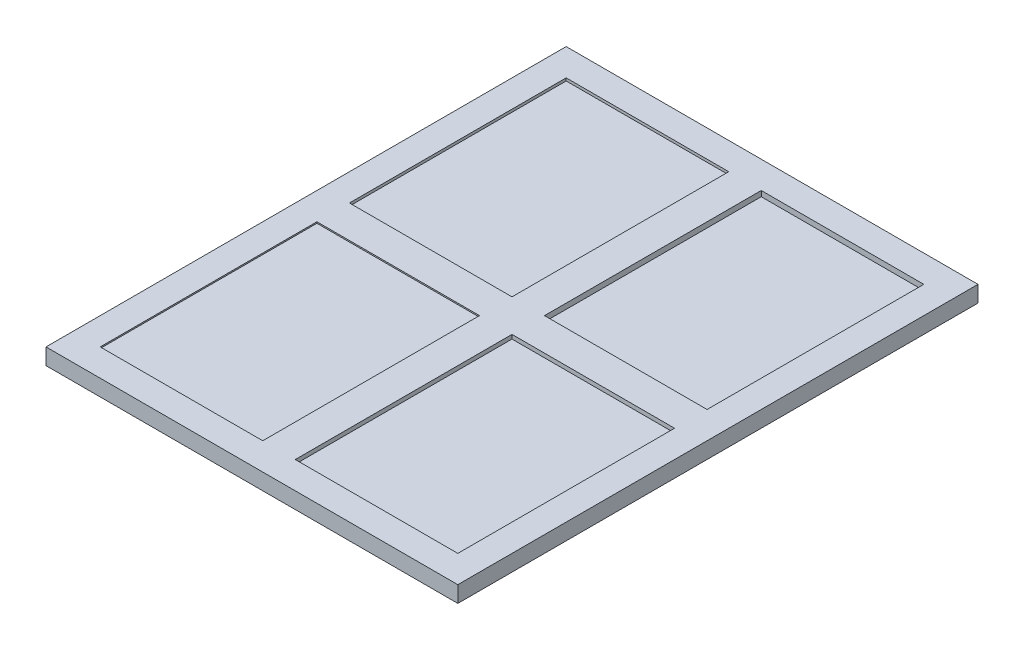
ISO-10303-21;
HEADER;
FILE_DESCRIPTION(('STEP AP214'),'2;1');
FILE_NAME('part.step','',(''),(''),'','','');
FILE_SCHEMA(('AUTOMOTIVE_DESIGN { 1 0 10303 214 1 1 1 1 }'));
ENDSEC;
DATA;
#1=APPLICATION_CONTEXT('core data for automotive mechanical design processes');
#2=APPLICATION_PROTOCOL_DEFINITION('international standard','automotive_design',2000,#1);
#3=PRODUCT_CONTEXT('',#1,'mechanical');
#4=PRODUCT('Part','Part','',(#3));
#5=PRODUCT_RELATED_PRODUCT_CATEGORY('part','',(#4));
#6=PRODUCT_DEFINITION_FORMATION('','',#4);
#7=PRODUCT_DEFINITION_CONTEXT('part definition',#1,'design');
#8=PRODUCT_DEFINITION('design','',#6,#7);
#9=PRODUCT_DEFINITION_SHAPE('','',#8);
#10=(LENGTH_UNIT() NAMED_UNIT(*) SI_UNIT(.MILLI.,.METRE.));
#11=(NAMED_UNIT(*) PLANE_ANGLE_UNIT() SI_UNIT($,.RADIAN.));
#12=(NAMED_UNIT(*) SI_UNIT($,.STERADIAN.) SOLID_ANGLE_UNIT());
#13=UNCERTAINTY_MEASURE_WITH_UNIT(LENGTH_MEASURE(1.E-05),#10,'distance_accuracy_value','');
#14=(GEOMETRIC_REPRESENTATION_CONTEXT(3) GLOBAL_UNCERTAINTY_ASSIGNED_CONTEXT((#13)) GLOBAL_UNIT_ASSIGNED_CONTEXT((#10,
#11,#12)) REPRESENTATION_CONTEXT('',''));
#15=CARTESIAN_POINT('',(0.,0.,0.));
#16=DIRECTION('',(0.,0.,1.));
#17=DIRECTION('',(1.,0.,0.));
#18=AXIS2_PLACEMENT_3D('',#15,#16,#17);
#19=CARTESIAN_POINT('',(0.,0.25,0.));
#20=DIRECTION('',(0.,1.,0.));
#21=DIRECTION('',(0.,0.,1.));
#22=AXIS2_PLACEMENT_3D('',#19,#20,#21);
#23=PLANE('',#22);
#24=DIRECTION('',(1.,0.,0.));
#25=VECTOR('',#24,1.);
#26=CARTESIAN_POINT('',(3.,0.25,43.));
#27=LINE('',#26,#25);
#28=CARTESIAN_POINT('',(3.,0.25,43.));
#29=VERTEX_POINT('',#28);
#30=CARTESIAN_POINT('',(33.,0.25,43.));
#31=VERTEX_POINT('',#30);
#32=EDGE_CURVE('E248',#29,#31,#27,.T.);
#33=ORIENTED_EDGE('',*,*,#32,.F.);
#34=DIRECTION('',(0.,0.,1.));
#35=VECTOR('',#34,1.);
#36=CARTESIAN_POINT('',(3.,0.25,3.));
#37=LINE('',#36,#35);
#38=CARTESIAN_POINT('',(3.,0.25,3.));
#39=VERTEX_POINT('',#38);
#40=EDGE_CURVE('E250',#39,#29,#37,.T.);
#41=ORIENTED_EDGE('',*,*,#40,.F.);
#42=DIRECTION('',(-1.,0.,0.));
#43=VECTOR('',#42,1.);
#44=CARTESIAN_POINT('',(3.,0.25,3.));
#45=LINE('',#44,#43);
#46=CARTESIAN_POINT('',(33.,0.25,3.));
#47=VERTEX_POINT('',#46);
#48=EDGE_CURVE('E243',#47,#39,#45,.T.);
#49=ORIENTED_EDGE('',*,*,#48,.F.);
#50=DIRECTION('',(0.,0.,-1.));
#51=VECTOR('',#50,1.);
#52=CARTESIAN_POINT('',(33.,0.25,3.));
#53=LINE('',#52,#51);
#54=EDGE_CURVE('E245',#31,#47,#53,.T.);
#55=ORIENTED_EDGE('',*,*,#54,.F.);
#56=EDGE_LOOP('',(#33,#41,#49,#55));
#57=FACE_BOUND('',#56,.T.);
#58=DIRECTION('',(1.,0.,0.));
#59=VECTOR('',#58,1.);
#60=CARTESIAN_POINT('',(-33.,0.25,-3.));
#61=LINE('',#60,#59);
#62=CARTESIAN_POINT('',(-33.,0.25,-3.));
#63=VERTEX_POINT('',#62);
#64=CARTESIAN_POINT('',(-3.,0.25,-3.));
#65=VERTEX_POINT('',#64);
#66=EDGE_CURVE('E214',#63,#65,#61,.T.);
#67=ORIENTED_EDGE('',*,*,#66,.F.);
#68=DIRECTION('',(0.,0.,1.));
#69=VECTOR('',#68,1.);
#70=CARTESIAN_POINT('',(-33.,0.25,-43.));
#71=LINE('',#70,#69);
#72=CARTESIAN_POINT('',(-33.,0.25,-43.));
#73=VERTEX_POINT('',#72);
#74=EDGE_CURVE('E216',#73,#63,#71,.T.);
#75=ORIENTED_EDGE('',*,*,#74,.F.);
#76=DIRECTION('',(-1.,0.,0.));
#77=VECTOR('',#76,1.);
#78=CARTESIAN_POINT('',(-33.,0.25,-43.));
#79=LINE('',#78,#77);
#80=CARTESIAN_POINT('',(-3.00000000000001,0.25,-43.));
#81=VERTEX_POINT('',#80);
#82=EDGE_CURVE('E209',#81,#73,#79,.T.);
#83=ORIENTED_EDGE('',*,*,#82,.F.);
#84=DIRECTION('',(0.,0.,-1.));
#85=VECTOR('',#84,1.);
#86=CARTESIAN_POINT('',(-3.00000000000001,0.25,-43.));
#87=LINE('',#86,#85);
#88=EDGE_CURVE('E211',#65,#81,#87,.T.);
#89=ORIENTED_EDGE('',*,*,#88,.F.);
#90=EDGE_LOOP('',(#67,#75,#83,#89));
#91=FACE_BOUND('',#90,.T.);
#92=DIRECTION('',(0.,0.,1.));
#93=VECTOR('',#92,1.);
#94=CARTESIAN_POINT('',(-38.,0.25,-48.));
#95=LINE('',#94,#93);
#96=CARTESIAN_POINT('',(-38.,0.25,-48.));
#97=VERTEX_POINT('',#96);
#98=CARTESIAN_POINT('',(-38.,0.25,48.));
#99=VERTEX_POINT('',#98);
#100=EDGE_CURVE('E198',#97,#99,#95,.T.);
#101=ORIENTED_EDGE('',*,*,#100,.T.);
#102=DIRECTION('',(1.,0.,0.));
#103=VECTOR('',#102,1.);
#104=CARTESIAN_POINT('',(-38.,0.25,48.));
#105=LINE('',#104,#103);
#106=CARTESIAN_POINT('',(38.,0.25,48.));
#107=VERTEX_POINT('',#106);
#108=EDGE_CURVE('E196',#99,#107,#105,.T.);
#109=ORIENTED_EDGE('',*,*,#108,.T.);
#110=DIRECTION('',(0.,0.,-1.));
#111=VECTOR('',#110,1.);
#112=CARTESIAN_POINT('',(38.,0.25,-48.));
#113=LINE('',#112,#111);
#114=CARTESIAN_POINT('',(38.,0.25,-48.));
#115=VERTEX_POINT('',#114);
#116=EDGE_CURVE('E185',#107,#115,#113,.T.);
#117=ORIENTED_EDGE('',*,*,#116,.T.);
#118=DIRECTION('',(-1.,0.,0.));
#119=VECTOR('',#118,1.);
#120=CARTESIAN_POINT('',(-38.,0.25,-48.));
#121=LINE('',#120,#119);
#122=EDGE_CURVE('E193',#115,#97,#121,.T.);
#123=ORIENTED_EDGE('',*,*,#122,.T.);
#124=EDGE_LOOP('',(#101,#109,#117,#123));
#125=FACE_BOUND('',#124,.T.);
#126=DIRECTION('',(1.,0.,0.));
#127=VECTOR('',#126,1.);
#128=CARTESIAN_POINT('',(3.,0.25,-3.));
#129=LINE('',#128,#127);
#130=CARTESIAN_POINT('',(3.,0.25,-3.));
#131=VERTEX_POINT('',#130);
#132=CARTESIAN_POINT('',(33.,0.25,-3.));
#133=VERTEX_POINT('',#132);
#134=EDGE_CURVE('E231',#131,#133,#129,.T.);
#135=ORIENTED_EDGE('',*,*,#134,.F.);
#136=DIRECTION('',(0.,0.,1.));
#137=VECTOR('',#136,1.);
#138=CARTESIAN_POINT('',(3.,0.25,-43.));
#139=LINE('',#138,#137);
#140=CARTESIAN_POINT('',(3.,0.25,-43.));
#141=VERTEX_POINT('',#140);
#142=EDGE_CURVE('E233',#141,#131,#139,.T.);
#143=ORIENTED_EDGE('',*,*,#142,.F.);
#144=DIRECTION('',(-1.,0.,0.));
#145=VECTOR('',#144,1.);
#146=CARTESIAN_POINT('',(3.,0.25,-43.));
#147=LINE('',#146,#145);
#148=CARTESIAN_POINT('',(33.,0.25,-43.));
#149=VERTEX_POINT('',#148);
#150=EDGE_CURVE('E226',#149,#141,#147,.T.);
#151=ORIENTED_EDGE('',*,*,#150,.F.);
#152=DIRECTION('',(0.,0.,-1.));
#153=VECTOR('',#152,1.);
#154=CARTESIAN_POINT('',(33.,0.25,-43.));
#155=LINE('',#154,#153);
#156=EDGE_CURVE('E228',#133,#149,#155,.T.);
#157=ORIENTED_EDGE('',*,*,#156,.F.);
#158=EDGE_LOOP('',(#135,#143,#151,#157));
#159=FACE_BOUND('',#158,.T.);
#160=DIRECTION('',(1.,0.,0.));
#161=VECTOR('',#160,1.);
#162=CARTESIAN_POINT('',(-33.,0.25,43.));
#163=LINE('',#162,#161);
#164=CARTESIAN_POINT('',(-33.,0.25,43.));
#165=VERTEX_POINT('',#164);
#166=CARTESIAN_POINT('',(-2.99999999999999,0.25,43.));
#167=VERTEX_POINT('',#166);
#168=EDGE_CURVE('E278',#165,#167,#163,.T.);
#169=ORIENTED_EDGE('',*,*,#168,.F.);
#170=DIRECTION('',(0.,0.,1.));
#171=VECTOR('',#170,1.);
#172=CARTESIAN_POINT('',(-33.,0.25,3.));
#173=LINE('',#172,#171);
#174=CARTESIAN_POINT('',(-33.,0.25,3.));
#175=VERTEX_POINT('',#174);
#176=EDGE_CURVE('E264',#175,#165,#173,.T.);
#177=ORIENTED_EDGE('',*,*,#176,.F.);
#178=DIRECTION('',(-1.,0.,0.));
#179=VECTOR('',#178,1.);
#180=CARTESIAN_POINT('',(-33.,0.25,3.));
#181=LINE('',#180,#179);
#182=CARTESIAN_POINT('',(-3.,0.25,3.));
#183=VERTEX_POINT('',#182);
#184=EDGE_CURVE('E260',#183,#175,#181,.T.);
#185=ORIENTED_EDGE('',*,*,#184,.F.);
#186=DIRECTION('',(0.,0.,-1.));
#187=VECTOR('',#186,1.);
#188=CARTESIAN_POINT('',(-3.,0.25,3.));
#189=LINE('',#188,#187);
#190=EDGE_CURVE('E276',#167,#183,#189,.T.);
#191=ORIENTED_EDGE('',*,*,#190,.F.);
#192=EDGE_LOOP('',(#169,#177,#185,#191));
#193=FACE_BOUND('',#192,.T.);
#194=ADVANCED_FACE('F33',(#57,#91,#125,#159,#193),#23,.T.);
#195=CARTESIAN_POINT('',(-38.,0.25,-48.));
#196=DIRECTION('',(1.,0.,0.));
#197=DIRECTION('',(0.,0.,-1.));
#198=AXIS2_PLACEMENT_3D('',#195,#196,#197);
#199=PLANE('',#198);
#200=DIRECTION('',(0.,-1.,0.));
#201=VECTOR('',#200,1.);
#202=CARTESIAN_POINT('',(-38.,0.25,-48.));
#203=LINE('',#202,#201);
#204=CARTESIAN_POINT('',(-38.,-2.75,-48.));
#205=VERTEX_POINT('',#204);
#206=EDGE_CURVE('E188',#97,#205,#203,.T.);
#207=ORIENTED_EDGE('',*,*,#206,.T.);
#208=DIRECTION('',(0.,0.,1.));
#209=VECTOR('',#208,1.);
#210=CARTESIAN_POINT('',(-38.,-2.75,-48.));
#211=LINE('',#210,#209);
#212=CARTESIAN_POINT('',(-38.,-2.75,48.));
#213=VERTEX_POINT('',#212);
#214=EDGE_CURVE('E48',#205,#213,#211,.T.);
#215=ORIENTED_EDGE('',*,*,#214,.T.);
#216=DIRECTION('',(0.,-1.,0.));
#217=VECTOR('',#216,1.);
#218=CARTESIAN_POINT('',(-38.,0.25,48.));
#219=LINE('',#218,#217);
#220=EDGE_CURVE('E41',#99,#213,#219,.T.);
#221=ORIENTED_EDGE('',*,*,#220,.F.);
#222=ORIENTED_EDGE('',*,*,#100,.F.);
#223=EDGE_LOOP('',(#207,#215,#221,#222));
#224=FACE_BOUND('',#223,.T.);
#225=ADVANCED_FACE('F35',(#224),#199,.F.);
#226=CARTESIAN_POINT('',(-38.,0.25,48.));
#227=DIRECTION('',(0.,0.,-1.));
#228=DIRECTION('',(-1.,0.,0.));
#229=AXIS2_PLACEMENT_3D('',#226,#227,#228);
#230=PLANE('',#229);
#231=ORIENTED_EDGE('',*,*,#220,.T.);
#232=DIRECTION('',(-1.,0.,0.));
#233=VECTOR('',#232,1.);
#234=CARTESIAN_POINT('',(-41.8589167350482,-2.75,48.));
#235=LINE('',#234,#233);
#236=CARTESIAN_POINT('',(38.,-2.75,48.));
#237=VERTEX_POINT('',#236);
#238=EDGE_CURVE('E170',#237,#213,#235,.T.);
#239=ORIENTED_EDGE('',*,*,#238,.F.);
#240=DIRECTION('',(0.,-1.,0.));
#241=VECTOR('',#240,1.);
#242=CARTESIAN_POINT('',(38.,0.25,48.));
#243=LINE('',#242,#241);
#244=EDGE_CURVE('E180',#107,#237,#243,.T.);
#245=ORIENTED_EDGE('',*,*,#244,.F.);
#246=ORIENTED_EDGE('',*,*,#108,.F.);
#247=EDGE_LOOP('',(#231,#239,#245,#246));
#248=FACE_BOUND('',#247,.T.);
#249=ADVANCED_FACE('F179',(#248),#230,.F.);
#250=CARTESIAN_POINT('',(38.,0.25,-48.));
#251=DIRECTION('',(-1.,0.,0.));
#252=DIRECTION('',(0.,0.,1.));
#253=AXIS2_PLACEMENT_3D('',#250,#251,#252);
#254=PLANE('',#253);
#255=ORIENTED_EDGE('',*,*,#244,.T.);
#256=DIRECTION('',(0.,0.,-1.));
#257=VECTOR('',#256,1.);
#258=CARTESIAN_POINT('',(38.,-2.75,-48.));
#259=LINE('',#258,#257);
#260=CARTESIAN_POINT('',(38.,-2.75,-48.));
#261=VERTEX_POINT('',#260);
#262=EDGE_CURVE('E167',#237,#261,#259,.T.);
#263=ORIENTED_EDGE('',*,*,#262,.T.);
#264=DIRECTION('',(0.,-1.,0.));
#265=VECTOR('',#264,1.);
#266=CARTESIAN_POINT('',(38.,0.25,-48.));
#267=LINE('',#266,#265);
#268=EDGE_CURVE('E186',#115,#261,#267,.T.);
#269=ORIENTED_EDGE('',*,*,#268,.F.);
#270=ORIENTED_EDGE('',*,*,#116,.F.);
#271=EDGE_LOOP('',(#255,#263,#269,#270));
#272=FACE_BOUND('',#271,.T.);
#273=ADVANCED_FACE('F184',(#272),#254,.F.);
#274=CARTESIAN_POINT('',(-38.,0.25,-48.));
#275=DIRECTION('',(0.,0.,1.));
#276=DIRECTION('',(1.,0.,0.));
#277=AXIS2_PLACEMENT_3D('',#274,#275,#276);
#278=PLANE('',#277);
#279=ORIENTED_EDGE('',*,*,#268,.T.);
#280=DIRECTION('',(-1.,0.,0.));
#281=VECTOR('',#280,1.);
#282=CARTESIAN_POINT('',(-38.,-2.75,-48.));
#283=LINE('',#282,#281);
#284=EDGE_CURVE('E11',#261,#205,#283,.T.);
#285=ORIENTED_EDGE('',*,*,#284,.T.);
#286=ORIENTED_EDGE('',*,*,#206,.F.);
#287=ORIENTED_EDGE('',*,*,#122,.F.);
#288=EDGE_LOOP('',(#279,#285,#286,#287));
#289=FACE_BOUND('',#288,.T.);
#290=ADVANCED_FACE('F321',(#289),#278,.F.);
#291=CARTESIAN_POINT('',(-33.,0.25,-43.));
#292=DIRECTION('',(1.,0.,0.));
#293=DIRECTION('',(0.,0.,-1.));
#294=AXIS2_PLACEMENT_3D('',#291,#292,#293);
#295=PLANE('',#294);
#296=DIRECTION('',(0.,-1.,0.));
#297=VECTOR('',#296,1.);
#298=CARTESIAN_POINT('',(-33.,0.25,-3.));
#299=LINE('',#298,#297);
#300=CARTESIAN_POINT('',(-33.,-0.25,-3.));
#301=VERTEX_POINT('',#300);
#302=EDGE_CURVE('E201',#63,#301,#299,.T.);
#303=ORIENTED_EDGE('',*,*,#302,.T.);
#304=DIRECTION('',(0.,0.,1.));
#305=VECTOR('',#304,1.);
#306=CARTESIAN_POINT('',(-33.,-0.25,-3.));
#307=LINE('',#306,#305);
#308=CARTESIAN_POINT('',(-33.,-0.25,-43.));
#309=VERTEX_POINT('',#308);
#310=EDGE_CURVE('E289',#309,#301,#307,.T.);
#311=ORIENTED_EDGE('',*,*,#310,.F.);
#312=DIRECTION('',(0.,-1.,0.));
#313=VECTOR('',#312,1.);
#314=CARTESIAN_POINT('',(-33.,0.25,-43.));
#315=LINE('',#314,#313);
#316=EDGE_CURVE('E207',#73,#309,#315,.T.);
#317=ORIENTED_EDGE('',*,*,#316,.F.);
#318=ORIENTED_EDGE('',*,*,#74,.T.);
#319=EDGE_LOOP('',(#303,#311,#317,#318));
#320=FACE_BOUND('',#319,.T.);
#321=ADVANCED_FACE('F407',(#320),#295,.T.);
#322=CARTESIAN_POINT('',(-33.,0.25,-3.));
#323=DIRECTION('',(0.,0.,-1.));
#324=DIRECTION('',(-1.,0.,0.));
#325=AXIS2_PLACEMENT_3D('',#322,#323,#324);
#326=PLANE('',#325);
#327=DIRECTION('',(0.,-1.,0.));
#328=VECTOR('',#327,1.);
#329=CARTESIAN_POINT('',(-3.,0.25,-3.));
#330=LINE('',#329,#328);
#331=CARTESIAN_POINT('',(-3.,-0.25,-3.));
#332=VERTEX_POINT('',#331);
#333=EDGE_CURVE('E203',#65,#332,#330,.T.);
#334=ORIENTED_EDGE('',*,*,#333,.T.);
#335=DIRECTION('',(1.,0.,0.));
#336=VECTOR('',#335,1.);
#337=CARTESIAN_POINT('',(-3.,-0.25,-3.));
#338=LINE('',#337,#336);
#339=EDGE_CURVE('E286',#301,#332,#338,.T.);
#340=ORIENTED_EDGE('',*,*,#339,.F.);
#341=ORIENTED_EDGE('',*,*,#302,.F.);
#342=ORIENTED_EDGE('',*,*,#66,.T.);
#343=EDGE_LOOP('',(#334,#340,#341,#342));
#344=FACE_BOUND('',#343,.T.);
#345=ADVANCED_FACE('F403',(#344),#326,.T.);
#346=CARTESIAN_POINT('',(-3.00000000000001,0.25,-43.));
#347=DIRECTION('',(-1.,0.,0.));
#348=DIRECTION('',(0.,0.,1.));
#349=AXIS2_PLACEMENT_3D('',#346,#347,#348);
#350=PLANE('',#349);
#351=DIRECTION('',(0.,-1.,0.));
#352=VECTOR('',#351,1.);
#353=CARTESIAN_POINT('',(-3.00000000000001,0.25,-43.));
#354=LINE('',#353,#352);
#355=CARTESIAN_POINT('',(-3.00000000000001,-0.25,-43.));
#356=VERTEX_POINT('',#355);
#357=EDGE_CURVE('E205',#81,#356,#354,.T.);
#358=ORIENTED_EDGE('',*,*,#357,.T.);
#359=DIRECTION('',(0.,0.,-1.));
#360=VECTOR('',#359,1.);
#361=CARTESIAN_POINT('',(-3.00000000000001,-0.25,-43.));
#362=LINE('',#361,#360);
#363=EDGE_CURVE('E283',#332,#356,#362,.T.);
#364=ORIENTED_EDGE('',*,*,#363,.F.);
#365=ORIENTED_EDGE('',*,*,#333,.F.);
#366=ORIENTED_EDGE('',*,*,#88,.T.);
#367=EDGE_LOOP('',(#358,#364,#365,#366));
#368=FACE_BOUND('',#367,.T.);
#369=ADVANCED_FACE('F399',(#368),#350,.T.);
#370=CARTESIAN_POINT('',(-33.,0.25,-43.));
#371=DIRECTION('',(0.,0.,1.));
#372=DIRECTION('',(1.,0.,0.));
#373=AXIS2_PLACEMENT_3D('',#370,#371,#372);
#374=PLANE('',#373);
#375=ORIENTED_EDGE('',*,*,#316,.T.);
#376=DIRECTION('',(-1.,0.,0.));
#377=VECTOR('',#376,1.);
#378=CARTESIAN_POINT('',(-33.,-0.25,-43.));
#379=LINE('',#378,#377);
#380=EDGE_CURVE('E274',#356,#309,#379,.T.);
#381=ORIENTED_EDGE('',*,*,#380,.F.);
#382=ORIENTED_EDGE('',*,*,#357,.F.);
#383=ORIENTED_EDGE('',*,*,#82,.T.);
#384=EDGE_LOOP('',(#375,#381,#382,#383));
#385=FACE_BOUND('',#384,.T.);
#386=ADVANCED_FACE('F395',(#385),#374,.T.);
#387=CARTESIAN_POINT('',(3.,0.25,-43.));
#388=DIRECTION('',(1.,0.,0.));
#389=DIRECTION('',(0.,0.,-1.));
#390=AXIS2_PLACEMENT_3D('',#387,#388,#389);
#391=PLANE('',#390);
#392=DIRECTION('',(0.,-1.,0.));
#393=VECTOR('',#392,1.);
#394=CARTESIAN_POINT('',(3.,0.25,-3.));
#395=LINE('',#394,#393);
#396=CARTESIAN_POINT('',(3.,-0.75,-3.));
#397=VERTEX_POINT('',#396);
#398=EDGE_CURVE('E218',#131,#397,#395,.T.);
#399=ORIENTED_EDGE('',*,*,#398,.T.);
#400=DIRECTION('',(0.,0.,1.));
#401=VECTOR('',#400,1.);
#402=CARTESIAN_POINT('',(3.,-0.75,-43.));
#403=LINE('',#402,#401);
#404=CARTESIAN_POINT('',(3.,-0.75,-43.));
#405=VERTEX_POINT('',#404);
#406=EDGE_CURVE('E313',#405,#397,#403,.T.);
#407=ORIENTED_EDGE('',*,*,#406,.F.);
#408=DIRECTION('',(0.,-1.,0.));
#409=VECTOR('',#408,1.);
#410=CARTESIAN_POINT('',(3.,0.25,-43.));
#411=LINE('',#410,#409);
#412=EDGE_CURVE('E224',#141,#405,#411,.T.);
#413=ORIENTED_EDGE('',*,*,#412,.F.);
#414=ORIENTED_EDGE('',*,*,#142,.T.);
#415=EDGE_LOOP('',(#399,#407,#413,#414));
#416=FACE_BOUND('',#415,.T.);
#417=ADVANCED_FACE('F391',(#416),#391,.T.);
#418=CARTESIAN_POINT('',(3.,0.25,-3.));
#419=DIRECTION('',(0.,0.,-1.));
#420=DIRECTION('',(-1.,0.,0.));
#421=AXIS2_PLACEMENT_3D('',#418,#419,#420);
#422=PLANE('',#421);
#423=DIRECTION('',(0.,-1.,0.));
#424=VECTOR('',#423,1.);
#425=CARTESIAN_POINT('',(33.,0.25,-3.));
#426=LINE('',#425,#424);
#427=CARTESIAN_POINT('',(33.,-0.75,-3.));
#428=VERTEX_POINT('',#427);
#429=EDGE_CURVE('E220',#133,#428,#426,.T.);
#430=ORIENTED_EDGE('',*,*,#429,.T.);
#431=DIRECTION('',(1.,0.,0.));
#432=VECTOR('',#431,1.);
#433=CARTESIAN_POINT('',(3.,-0.75,-3.));
#434=LINE('',#433,#432);
#435=EDGE_CURVE('E310',#397,#428,#434,.T.);
#436=ORIENTED_EDGE('',*,*,#435,.F.);
#437=ORIENTED_EDGE('',*,*,#398,.F.);
#438=ORIENTED_EDGE('',*,*,#134,.T.);
#439=EDGE_LOOP('',(#430,#436,#437,#438));
#440=FACE_BOUND('',#439,.T.);
#441=ADVANCED_FACE('F387',(#440),#422,.T.);
#442=CARTESIAN_POINT('',(33.,0.25,-43.));
#443=DIRECTION('',(-1.,0.,0.));
#444=DIRECTION('',(0.,0.,1.));
#445=AXIS2_PLACEMENT_3D('',#442,#443,#444);
#446=PLANE('',#445);
#447=DIRECTION('',(0.,-1.,0.));
#448=VECTOR('',#447,1.);
#449=CARTESIAN_POINT('',(33.,0.25,-43.));
#450=LINE('',#449,#448);
#451=CARTESIAN_POINT('',(33.,-0.75,-43.));
#452=VERTEX_POINT('',#451);
#453=EDGE_CURVE('E222',#149,#452,#450,.T.);
#454=ORIENTED_EDGE('',*,*,#453,.T.);
#455=DIRECTION('',(0.,0.,-1.));
#456=VECTOR('',#455,1.);
#457=CARTESIAN_POINT('',(33.,-0.75,-43.));
#458=LINE('',#457,#456);
#459=EDGE_CURVE('E307',#428,#452,#458,.T.);
#460=ORIENTED_EDGE('',*,*,#459,.F.);
#461=ORIENTED_EDGE('',*,*,#429,.F.);
#462=ORIENTED_EDGE('',*,*,#156,.T.);
#463=EDGE_LOOP('',(#454,#460,#461,#462));
#464=FACE_BOUND('',#463,.T.);
#465=ADVANCED_FACE('F383',(#464),#446,.T.);
#466=CARTESIAN_POINT('',(3.,0.25,-43.));
#467=DIRECTION('',(0.,0.,1.));
#468=DIRECTION('',(1.,0.,0.));
#469=AXIS2_PLACEMENT_3D('',#466,#467,#468);
#470=PLANE('',#469);
#471=ORIENTED_EDGE('',*,*,#412,.T.);
#472=DIRECTION('',(-1.,0.,0.));
#473=VECTOR('',#472,1.);
#474=CARTESIAN_POINT('',(3.,-0.75,-43.));
#475=LINE('',#474,#473);
#476=EDGE_CURVE('E304',#452,#405,#475,.T.);
#477=ORIENTED_EDGE('',*,*,#476,.F.);
#478=ORIENTED_EDGE('',*,*,#453,.F.);
#479=ORIENTED_EDGE('',*,*,#150,.T.);
#480=EDGE_LOOP('',(#471,#477,#478,#479));
#481=FACE_BOUND('',#480,.T.);
#482=ADVANCED_FACE('F379',(#481),#470,.T.);
#483=CARTESIAN_POINT('',(3.,0.25,3.));
#484=DIRECTION('',(1.,0.,0.));
#485=DIRECTION('',(0.,0.,-1.));
#486=AXIS2_PLACEMENT_3D('',#483,#484,#485);
#487=PLANE('',#486);
#488=DIRECTION('',(0.,-1.,0.));
#489=VECTOR('',#488,1.);
#490=CARTESIAN_POINT('',(3.,0.25,43.));
#491=LINE('',#490,#489);
#492=CARTESIAN_POINT('',(3.,-0.5,43.));
#493=VERTEX_POINT('',#492);
#494=EDGE_CURVE('E235',#29,#493,#491,.T.);
#495=ORIENTED_EDGE('',*,*,#494,.T.);
#496=DIRECTION('',(0.,0.,1.));
#497=VECTOR('',#496,1.);
#498=CARTESIAN_POINT('',(3.,-0.5,3.));
#499=LINE('',#498,#497);
#500=CARTESIAN_POINT('',(3.,-0.5,3.));
#501=VERTEX_POINT('',#500);
#502=EDGE_CURVE('E301',#501,#493,#499,.T.);
#503=ORIENTED_EDGE('',*,*,#502,.F.);
#504=DIRECTION('',(0.,-1.,0.));
#505=VECTOR('',#504,1.);
#506=CARTESIAN_POINT('',(3.,0.25,3.));
#507=LINE('',#506,#505);
#508=EDGE_CURVE('E241',#39,#501,#507,.T.);
#509=ORIENTED_EDGE('',*,*,#508,.F.);
#510=ORIENTED_EDGE('',*,*,#40,.T.);
#511=EDGE_LOOP('',(#495,#503,#509,#510));
#512=FACE_BOUND('',#511,.T.);
#513=ADVANCED_FACE('F375',(#512),#487,.T.);
#514=CARTESIAN_POINT('',(3.,0.25,43.));
#515=DIRECTION('',(0.,0.,-1.));
#516=DIRECTION('',(-1.,0.,0.));
#517=AXIS2_PLACEMENT_3D('',#514,#515,#516);
#518=PLANE('',#517);
#519=DIRECTION('',(0.,-1.,0.));
#520=VECTOR('',#519,1.);
#521=CARTESIAN_POINT('',(33.,0.25,43.));
#522=LINE('',#521,#520);
#523=CARTESIAN_POINT('',(33.,-0.5,43.));
#524=VERTEX_POINT('',#523);
#525=EDGE_CURVE('E237',#31,#524,#522,.T.);
#526=ORIENTED_EDGE('',*,*,#525,.T.);
#527=DIRECTION('',(1.,0.,0.));
#528=VECTOR('',#527,1.);
#529=CARTESIAN_POINT('',(3.,-0.5,43.));
#530=LINE('',#529,#528);
#531=EDGE_CURVE('E298',#493,#524,#530,.T.);
#532=ORIENTED_EDGE('',*,*,#531,.F.);
#533=ORIENTED_EDGE('',*,*,#494,.F.);
#534=ORIENTED_EDGE('',*,*,#32,.T.);
#535=EDGE_LOOP('',(#526,#532,#533,#534));
#536=FACE_BOUND('',#535,.T.);
#537=ADVANCED_FACE('F371',(#536),#518,.T.);
#538=CARTESIAN_POINT('',(33.,0.25,3.));
#539=DIRECTION('',(-1.,0.,0.));
#540=DIRECTION('',(0.,0.,1.));
#541=AXIS2_PLACEMENT_3D('',#538,#539,#540);
#542=PLANE('',#541);
#543=DIRECTION('',(0.,-1.,0.));
#544=VECTOR('',#543,1.);
#545=CARTESIAN_POINT('',(33.,0.25,3.));
#546=LINE('',#545,#544);
#547=CARTESIAN_POINT('',(33.,-0.5,3.));
#548=VERTEX_POINT('',#547);
#549=EDGE_CURVE('E239',#47,#548,#546,.T.);
#550=ORIENTED_EDGE('',*,*,#549,.T.);
#551=DIRECTION('',(0.,0.,-1.));
#552=VECTOR('',#551,1.);
#553=CARTESIAN_POINT('',(33.,-0.5,3.));
#554=LINE('',#553,#552);
#555=EDGE_CURVE('E295',#524,#548,#554,.T.);
#556=ORIENTED_EDGE('',*,*,#555,.F.);
#557=ORIENTED_EDGE('',*,*,#525,.F.);
#558=ORIENTED_EDGE('',*,*,#54,.T.);
#559=EDGE_LOOP('',(#550,#556,#557,#558));
#560=FACE_BOUND('',#559,.T.);
#561=ADVANCED_FACE('F367',(#560),#542,.T.);
#562=CARTESIAN_POINT('',(3.,0.25,3.));
#563=DIRECTION('',(0.,0.,1.));
#564=DIRECTION('',(1.,0.,0.));
#565=AXIS2_PLACEMENT_3D('',#562,#563,#564);
#566=PLANE('',#565);
#567=ORIENTED_EDGE('',*,*,#508,.T.);
#568=DIRECTION('',(-1.,0.,0.));
#569=VECTOR('',#568,1.);
#570=CARTESIAN_POINT('',(3.,-0.5,3.));
#571=LINE('',#570,#569);
#572=EDGE_CURVE('E292',#548,#501,#571,.T.);
#573=ORIENTED_EDGE('',*,*,#572,.F.);
#574=ORIENTED_EDGE('',*,*,#549,.F.);
#575=ORIENTED_EDGE('',*,*,#48,.T.);
#576=EDGE_LOOP('',(#567,#573,#574,#575));
#577=FACE_BOUND('',#576,.T.);
#578=ADVANCED_FACE('F364',(#577),#566,.T.);
#579=CARTESIAN_POINT('',(-33.,0.25,3.));
#580=DIRECTION('',(1.,0.,0.));
#581=DIRECTION('',(0.,0.,-1.));
#582=AXIS2_PLACEMENT_3D('',#579,#580,#581);
#583=PLANE('',#582);
#584=DIRECTION('',(0.,0.,1.));
#585=VECTOR('',#584,1.);
#586=CARTESIAN_POINT('',(-33.,0.,3.));
#587=LINE('',#586,#585);
#588=CARTESIAN_POINT('',(-33.,0.,3.));
#589=VERTEX_POINT('',#588);
#590=CARTESIAN_POINT('',(-33.,0.,43.));
#591=VERTEX_POINT('',#590);
#592=EDGE_CURVE('E271',#589,#591,#587,.T.);
#593=ORIENTED_EDGE('',*,*,#592,.F.);
#594=DIRECTION('',(0.,-1.,0.));
#595=VECTOR('',#594,1.);
#596=CARTESIAN_POINT('',(-33.,0.25,3.));
#597=LINE('',#596,#595);
#598=EDGE_CURVE('E258',#175,#589,#597,.T.);
#599=ORIENTED_EDGE('',*,*,#598,.F.);
#600=ORIENTED_EDGE('',*,*,#176,.T.);
#601=DIRECTION('',(0.,-1.,0.));
#602=VECTOR('',#601,1.);
#603=CARTESIAN_POINT('',(-33.,0.25,43.));
#604=LINE('',#603,#602);
#605=EDGE_CURVE('E252',#165,#591,#604,.T.);
#606=ORIENTED_EDGE('',*,*,#605,.T.);
#607=EDGE_LOOP('',(#593,#599,#600,#606));
#608=FACE_BOUND('',#607,.T.);
#609=ADVANCED_FACE('F346',(#608),#583,.T.);
#610=CARTESIAN_POINT('',(-33.,0.25,43.));
#611=DIRECTION('',(0.,0.,-1.));
#612=DIRECTION('',(-1.,0.,0.));
#613=AXIS2_PLACEMENT_3D('',#610,#611,#612);
#614=PLANE('',#613);
#615=DIRECTION('',(1.,0.,0.));
#616=VECTOR('',#615,1.);
#617=CARTESIAN_POINT('',(-33.,0.,43.));
#618=LINE('',#617,#616);
#619=CARTESIAN_POINT('',(-2.99999999999999,0.,43.));
#620=VERTEX_POINT('',#619);
#621=EDGE_CURVE('E268',#591,#620,#618,.T.);
#622=ORIENTED_EDGE('',*,*,#621,.F.);
#623=ORIENTED_EDGE('',*,*,#605,.F.);
#624=ORIENTED_EDGE('',*,*,#168,.T.);
#625=DIRECTION('',(0.,-1.,0.));
#626=VECTOR('',#625,1.);
#627=CARTESIAN_POINT('',(-2.99999999999999,0.25,43.));
#628=LINE('',#627,#626);
#629=EDGE_CURVE('E255',#167,#620,#628,.T.);
#630=ORIENTED_EDGE('',*,*,#629,.T.);
#631=EDGE_LOOP('',(#622,#623,#624,#630));
#632=FACE_BOUND('',#631,.T.);
#633=ADVANCED_FACE('F338',(#632),#614,.T.);
#634=CARTESIAN_POINT('',(-3.,0.25,3.));
#635=DIRECTION('',(-1.,0.,0.));
#636=DIRECTION('',(0.,0.,1.));
#637=AXIS2_PLACEMENT_3D('',#634,#635,#636);
#638=PLANE('',#637);
#639=DIRECTION('',(0.,0.,-1.));
#640=VECTOR('',#639,1.);
#641=CARTESIAN_POINT('',(-3.,0.,3.));
#642=LINE('',#641,#640);
#643=CARTESIAN_POINT('',(-3.,0.,3.));
#644=VERTEX_POINT('',#643);
#645=EDGE_CURVE('E265',#620,#644,#642,.T.);
#646=ORIENTED_EDGE('',*,*,#645,.F.);
#647=ORIENTED_EDGE('',*,*,#629,.F.);
#648=ORIENTED_EDGE('',*,*,#190,.T.);
#649=DIRECTION('',(0.,-1.,0.));
#650=VECTOR('',#649,1.);
#651=CARTESIAN_POINT('',(-3.,0.25,3.));
#652=LINE('',#651,#650);
#653=EDGE_CURVE('E55',#183,#644,#652,.T.);
#654=ORIENTED_EDGE('',*,*,#653,.T.);
#655=EDGE_LOOP('',(#646,#647,#648,#654));
#656=FACE_BOUND('',#655,.T.);
#657=ADVANCED_FACE('F341',(#656),#638,.T.);
#658=CARTESIAN_POINT('',(-33.,0.25,3.));
#659=DIRECTION('',(0.,0.,1.));
#660=DIRECTION('',(1.,0.,0.));
#661=AXIS2_PLACEMENT_3D('',#658,#659,#660);
#662=PLANE('',#661);
#663=DIRECTION('',(-1.,0.,0.));
#664=VECTOR('',#663,1.);
#665=CARTESIAN_POINT('',(-33.,0.,3.));
#666=LINE('',#665,#664);
#667=EDGE_CURVE('E261',#644,#589,#666,.T.);
#668=ORIENTED_EDGE('',*,*,#667,.F.);
#669=ORIENTED_EDGE('',*,*,#653,.F.);
#670=ORIENTED_EDGE('',*,*,#184,.T.);
#671=ORIENTED_EDGE('',*,*,#598,.T.);
#672=EDGE_LOOP('',(#668,#669,#670,#671));
#673=FACE_BOUND('',#672,.T.);
#674=ADVANCED_FACE('F348',(#673),#662,.T.);
#675=CARTESIAN_POINT('',(0.,0.,0.));
#676=DIRECTION('',(0.,-1.,0.));
#677=DIRECTION('',(0.,0.,-1.));
#678=AXIS2_PLACEMENT_3D('',#675,#676,#677);
#679=PLANE('',#678);
#680=ORIENTED_EDGE('',*,*,#592,.T.);
#681=ORIENTED_EDGE('',*,*,#621,.T.);
#682=ORIENTED_EDGE('',*,*,#645,.T.);
#683=ORIENTED_EDGE('',*,*,#667,.T.);
#684=EDGE_LOOP('',(#680,#681,#682,#683));
#685=FACE_BOUND('',#684,.T.);
#686=ADVANCED_FACE('F343',(#685),#679,.F.);
#687=CARTESIAN_POINT('',(0.,-0.25,0.));
#688=DIRECTION('',(0.,-1.,0.));
#689=DIRECTION('',(0.,0.,-1.));
#690=AXIS2_PLACEMENT_3D('',#687,#688,#689);
#691=PLANE('',#690);
#692=ORIENTED_EDGE('',*,*,#310,.T.);
#693=ORIENTED_EDGE('',*,*,#339,.T.);
#694=ORIENTED_EDGE('',*,*,#363,.T.);
#695=ORIENTED_EDGE('',*,*,#380,.T.);
#696=EDGE_LOOP('',(#692,#693,#694,#695));
#697=FACE_BOUND('',#696,.T.);
#698=ADVANCED_FACE('F355',(#697),#691,.F.);
#699=CARTESIAN_POINT('',(0.,-0.5,0.));
#700=DIRECTION('',(0.,1.,0.));
#701=DIRECTION('',(0.,0.,1.));
#702=AXIS2_PLACEMENT_3D('',#699,#700,#701);
#703=PLANE('',#702);
#704=ORIENTED_EDGE('',*,*,#502,.T.);
#705=ORIENTED_EDGE('',*,*,#531,.T.);
#706=ORIENTED_EDGE('',*,*,#555,.T.);
#707=ORIENTED_EDGE('',*,*,#572,.T.);
#708=EDGE_LOOP('',(#704,#705,#706,#707));
#709=FACE_BOUND('',#708,.T.);
#710=ADVANCED_FACE('F494',(#709),#703,.T.);
#711=CARTESIAN_POINT('',(0.,-0.75,0.));
#712=DIRECTION('',(0.,1.,0.));
#713=DIRECTION('',(0.,0.,1.));
#714=AXIS2_PLACEMENT_3D('',#711,#712,#713);
#715=PLANE('',#714);
#716=ORIENTED_EDGE('',*,*,#406,.T.);
#717=ORIENTED_EDGE('',*,*,#435,.T.);
#718=ORIENTED_EDGE('',*,*,#459,.T.);
#719=ORIENTED_EDGE('',*,*,#476,.T.);
#720=EDGE_LOOP('',(#716,#717,#718,#719));
#721=FACE_BOUND('',#720,.T.);
#722=ADVANCED_FACE('F530',(#721),#715,.T.);
#723=CARTESIAN_POINT('',(-41.8589167350482,-2.75,-59.75));
#724=DIRECTION('',(0.,1.,0.));
#725=DIRECTION('',(0.,0.,1.));
#726=AXIS2_PLACEMENT_3D('',#723,#724,#725);
#727=PLANE('',#726);
#728=ORIENTED_EDGE('',*,*,#284,.F.);
#729=ORIENTED_EDGE('',*,*,#262,.F.);
#730=ORIENTED_EDGE('',*,*,#238,.T.);
#731=ORIENTED_EDGE('',*,*,#214,.F.);
#732=EDGE_LOOP('',(#728,#729,#730,#731));
#733=FACE_BOUND('',#732,.T.);
#734=ADVANCED_FACE('F169',(#733),#727,.F.);
#735=CLOSED_SHELL('',(#194,#225,#249,#273,#290,#321,#345,#369,#386,#417,#441,#465,#482,#513,
#537,#561,#578,#609,#633,#657,#674,#686,#698,#710,#722,#734));
#736=MANIFOLD_SOLID_BREP('B2',#735);
#737=ADVANCED_BREP_SHAPE_REPRESENTATION('',(#18,#736),#14);
#738=SHAPE_DEFINITION_REPRESENTATION(#9,#737);
ENDSEC;
END-ISO-10303-21;
